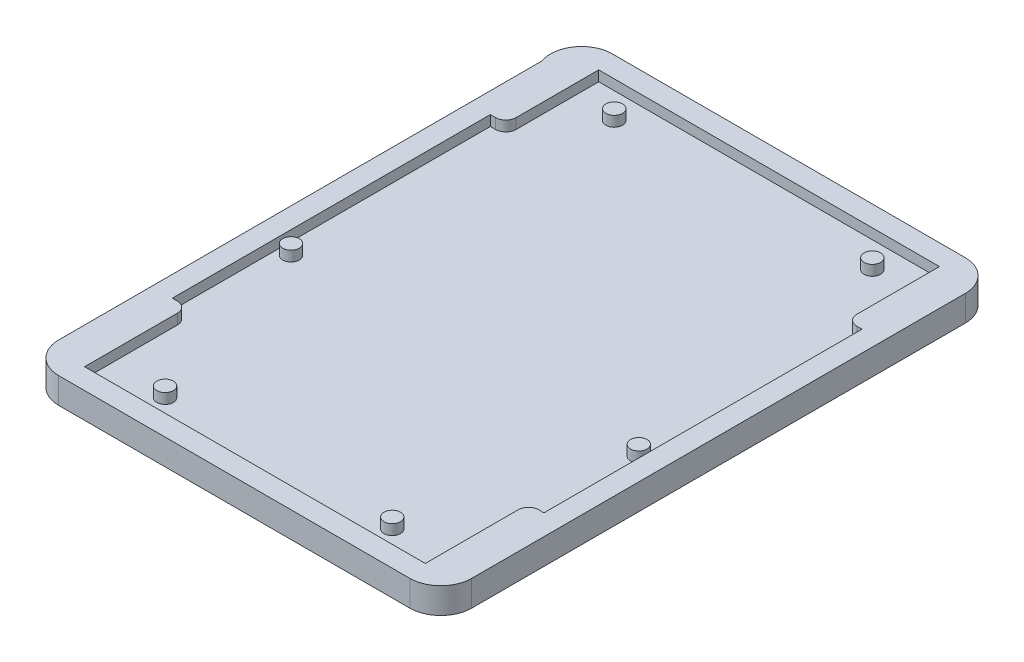
ISO-10303-21;
HEADER;
FILE_DESCRIPTION(('STEP AP214'),'2;1');
FILE_NAME('part.step','',(''),(''),'','','');
FILE_SCHEMA(('AUTOMOTIVE_DESIGN { 1 0 10303 214 1 1 1 1 }'));
ENDSEC;
DATA;
#1=APPLICATION_CONTEXT('core data for automotive mechanical design processes');
#2=APPLICATION_PROTOCOL_DEFINITION('international standard','automotive_design',2000,#1);
#3=PRODUCT_CONTEXT('',#1,'mechanical');
#4=PRODUCT('Part','Part','',(#3));
#5=PRODUCT_RELATED_PRODUCT_CATEGORY('part','',(#4));
#6=PRODUCT_DEFINITION_FORMATION('','',#4);
#7=PRODUCT_DEFINITION_CONTEXT('part definition',#1,'design');
#8=PRODUCT_DEFINITION('design','',#6,#7);
#9=PRODUCT_DEFINITION_SHAPE('','',#8);
#10=(LENGTH_UNIT() NAMED_UNIT(*) SI_UNIT(.MILLI.,.METRE.));
#11=(NAMED_UNIT(*) PLANE_ANGLE_UNIT() SI_UNIT($,.RADIAN.));
#12=(NAMED_UNIT(*) SI_UNIT($,.STERADIAN.) SOLID_ANGLE_UNIT());
#13=UNCERTAINTY_MEASURE_WITH_UNIT(LENGTH_MEASURE(1.E-05),#10,'distance_accuracy_value','');
#14=(GEOMETRIC_REPRESENTATION_CONTEXT(3) GLOBAL_UNCERTAINTY_ASSIGNED_CONTEXT((#13)) GLOBAL_UNIT_ASSIGNED_CONTEXT((#10,
#11,#12)) REPRESENTATION_CONTEXT('',''));
#15=CARTESIAN_POINT('',(0.,0.,0.));
#16=DIRECTION('',(0.,0.,1.));
#17=DIRECTION('',(1.,0.,0.));
#18=AXIS2_PLACEMENT_3D('',#15,#16,#17);
#19=CARTESIAN_POINT('',(1.65329983228431,2.,1.98997487421323));
#20=DIRECTION('',(0.,-1.,0.));
#21=DIRECTION('',(0.,0.,-1.));
#22=AXIS2_PLACEMENT_3D('',#19,#20,#21);
#23=PLANE('',#22);
#24=CARTESIAN_POINT('',(1.65329983228431,2.,1.98997487421323));
#25=DIRECTION('',(0.,-1.,0.));
#26=DIRECTION('',(0.,0.,-1.));
#27=AXIS2_PLACEMENT_3D('',#24,#25,#26);
#28=CIRCLE('',#27,5.99999999999999);
#29=CARTESIAN_POINT('',(-3.99999999999999,2.,4.00000000000002));
#30=VERTEX_POINT('',#29);
#31=CARTESIAN_POINT('',(2.,2.,-4.));
#32=VERTEX_POINT('',#31);
#33=EDGE_CURVE('E172',#30,#32,#28,.T.);
#34=ORIENTED_EDGE('',*,*,#33,.F.);
#35=DIRECTION('',(0.,0.,-1.));
#36=VECTOR('',#35,1.);
#37=CARTESIAN_POINT('',(-3.99999999999999,2.,97.6));
#38=LINE('',#37,#36);
#39=CARTESIAN_POINT('',(-3.99999999999999,2.,97.6));
#40=VERTEX_POINT('',#39);
#41=EDGE_CURVE('E141',#40,#30,#38,.T.);
#42=ORIENTED_EDGE('',*,*,#41,.F.);
#43=CARTESIAN_POINT('',(2.00000000000001,2.,97.6));
#44=DIRECTION('',(0.,-1.,0.));
#45=DIRECTION('',(0.,0.,-1.));
#46=AXIS2_PLACEMENT_3D('',#43,#44,#45);
#47=CIRCLE('',#46,6.);
#48=CARTESIAN_POINT('',(2.00000000000001,2.,103.6));
#49=VERTEX_POINT('',#48);
#50=EDGE_CURVE('E130',#49,#40,#47,.T.);
#51=ORIENTED_EDGE('',*,*,#50,.F.);
#52=DIRECTION('',(-1.,0.,0.));
#53=VECTOR('',#52,1.);
#54=CARTESIAN_POINT('',(70.,2.,103.6));
#55=LINE('',#54,#53);
#56=CARTESIAN_POINT('',(70.,2.,103.6));
#57=VERTEX_POINT('',#56);
#58=EDGE_CURVE('E142',#57,#49,#55,.T.);
#59=ORIENTED_EDGE('',*,*,#58,.F.);
#60=CARTESIAN_POINT('',(70.,2.,97.6));
#61=DIRECTION('',(0.,-1.,0.));
#62=DIRECTION('',(0.,0.,-1.));
#63=AXIS2_PLACEMENT_3D('',#60,#61,#62);
#64=CIRCLE('',#63,6.00000000000001);
#65=CARTESIAN_POINT('',(76.,2.,97.6));
#66=VERTEX_POINT('',#65);
#67=EDGE_CURVE('E146',#66,#57,#64,.T.);
#68=ORIENTED_EDGE('',*,*,#67,.F.);
#69=DIRECTION('',(0.,0.,1.));
#70=VECTOR('',#69,1.);
#71=CARTESIAN_POINT('',(76.,2.,18.));
#72=LINE('',#71,#70);
#73=CARTESIAN_POINT('',(76.,2.,2.00000000000004));
#74=VERTEX_POINT('',#73);
#75=EDGE_CURVE('E147',#74,#66,#72,.T.);
#76=ORIENTED_EDGE('',*,*,#75,.F.);
#77=CARTESIAN_POINT('',(70.,2.,2.));
#78=DIRECTION('',(0.,-1.,0.));
#79=DIRECTION('',(0.,0.,1.));
#80=AXIS2_PLACEMENT_3D('',#77,#78,#79);
#81=CIRCLE('',#80,6.);
#82=CARTESIAN_POINT('',(70.,2.,-4.));
#83=VERTEX_POINT('',#82);
#84=EDGE_CURVE('E337',#83,#74,#81,.T.);
#85=ORIENTED_EDGE('',*,*,#84,.F.);
#86=DIRECTION('',(1.,0.,0.));
#87=VECTOR('',#86,1.);
#88=CARTESIAN_POINT('',(2.,2.,-4.));
#89=LINE('',#88,#87);
#90=EDGE_CURVE('E332',#32,#83,#89,.T.);
#91=ORIENTED_EDGE('',*,*,#90,.F.);
#92=EDGE_LOOP('',(#34,#42,#51,#59,#68,#76,#85,#91));
#93=FACE_BOUND('',#92,.T.);
#94=CARTESIAN_POINT('',(1.,2.,16.));
#95=DIRECTION('',(0.,1.,0.));
#96=DIRECTION('',(0.,0.,1.));
#97=AXIS2_PLACEMENT_3D('',#94,#95,#96);
#98=CIRCLE('',#97,2.);
#99=CARTESIAN_POINT('',(3.,2.,16.));
#100=VERTEX_POINT('',#99);
#101=CARTESIAN_POINT('',(1.,2.,18.));
#102=VERTEX_POINT('',#101);
#103=EDGE_CURVE('E304',#100,#102,#98,.F.);
#104=ORIENTED_EDGE('',*,*,#103,.F.);
#105=DIRECTION('',(0.,0.,1.));
#106=VECTOR('',#105,1.);
#107=CARTESIAN_POINT('',(3.,2.,0.));
#108=LINE('',#107,#106);
#109=CARTESIAN_POINT('',(3.,2.,0.));
#110=VERTEX_POINT('',#109);
#111=EDGE_CURVE('E736',#110,#100,#108,.T.);
#112=ORIENTED_EDGE('',*,*,#111,.F.);
#113=DIRECTION('',(-1.,0.,0.));
#114=VECTOR('',#113,1.);
#115=CARTESIAN_POINT('',(0.,2.,0.));
#116=LINE('',#115,#114);
#117=CARTESIAN_POINT('',(69.,2.,0.));
#118=VERTEX_POINT('',#117);
#119=EDGE_CURVE('E265',#118,#110,#116,.T.);
#120=ORIENTED_EDGE('',*,*,#119,.F.);
#121=DIRECTION('',(0.,0.,1.));
#122=VECTOR('',#121,1.);
#123=CARTESIAN_POINT('',(69.,2.,0.));
#124=LINE('',#123,#122);
#125=CARTESIAN_POINT('',(69.,2.,16.));
#126=VERTEX_POINT('',#125);
#127=EDGE_CURVE('E810',#118,#126,#124,.T.);
#128=ORIENTED_EDGE('',*,*,#127,.T.);
#129=CARTESIAN_POINT('',(71.,2.,16.));
#130=DIRECTION('',(0.,1.,0.));
#131=DIRECTION('',(0.,0.,1.));
#132=AXIS2_PLACEMENT_3D('',#129,#130,#131);
#133=CIRCLE('',#132,2.);
#134=CARTESIAN_POINT('',(71.,2.,18.));
#135=VERTEX_POINT('',#134);
#136=EDGE_CURVE('E299',#135,#126,#133,.F.);
#137=ORIENTED_EDGE('',*,*,#136,.F.);
#138=DIRECTION('',(1.,0.,0.));
#139=VECTOR('',#138,1.);
#140=CARTESIAN_POINT('',(69.,2.,18.));
#141=LINE('',#140,#139);
#142=CARTESIAN_POINT('',(72.,2.,18.));
#143=VERTEX_POINT('',#142);
#144=EDGE_CURVE('E804',#135,#143,#141,.T.);
#145=ORIENTED_EDGE('',*,*,#144,.T.);
#146=DIRECTION('',(0.,0.,-1.));
#147=VECTOR('',#146,1.);
#148=CARTESIAN_POINT('',(72.,2.,0.));
#149=LINE('',#148,#147);
#150=CARTESIAN_POINT('',(72.,2.,79.6));
#151=VERTEX_POINT('',#150);
#152=EDGE_CURVE('E259',#151,#143,#149,.T.);
#153=ORIENTED_EDGE('',*,*,#152,.F.);
#154=DIRECTION('',(1.,0.,0.));
#155=VECTOR('',#154,1.);
#156=CARTESIAN_POINT('',(69.,2.,79.6));
#157=LINE('',#156,#155);
#158=CARTESIAN_POINT('',(71.,2.,79.6));
#159=VERTEX_POINT('',#158);
#160=EDGE_CURVE('E732',#159,#151,#157,.T.);
#161=ORIENTED_EDGE('',*,*,#160,.F.);
#162=CARTESIAN_POINT('',(71.,2.,81.6));
#163=DIRECTION('',(0.,1.,0.));
#164=DIRECTION('',(0.,0.,1.));
#165=AXIS2_PLACEMENT_3D('',#162,#163,#164);
#166=CIRCLE('',#165,2.);
#167=CARTESIAN_POINT('',(69.,2.,81.6));
#168=VERTEX_POINT('',#167);
#169=EDGE_CURVE('E330',#168,#159,#166,.F.);
#170=ORIENTED_EDGE('',*,*,#169,.F.);
#171=DIRECTION('',(0.,0.,1.));
#172=VECTOR('',#171,1.);
#173=CARTESIAN_POINT('',(69.,2.,79.6));
#174=LINE('',#173,#172);
#175=CARTESIAN_POINT('',(69.,2.,99.6));
#176=VERTEX_POINT('',#175);
#177=EDGE_CURVE('E58',#168,#176,#174,.T.);
#178=ORIENTED_EDGE('',*,*,#177,.T.);
#179=DIRECTION('',(1.,0.,0.));
#180=VECTOR('',#179,1.);
#181=CARTESIAN_POINT('',(0.,2.,99.6));
#182=LINE('',#181,#180);
#183=CARTESIAN_POINT('',(3.00000000000001,2.,99.6));
#184=VERTEX_POINT('',#183);
#185=EDGE_CURVE('E256',#184,#176,#182,.T.);
#186=ORIENTED_EDGE('',*,*,#185,.F.);
#187=DIRECTION('',(0.,0.,1.));
#188=VECTOR('',#187,1.);
#189=CARTESIAN_POINT('',(2.99999999999989,2.,0.));
#190=LINE('',#189,#188);
#191=CARTESIAN_POINT('',(3.00000000000002,2.,81.6));
#192=VERTEX_POINT('',#191);
#193=EDGE_CURVE('E739',#192,#184,#190,.T.);
#194=ORIENTED_EDGE('',*,*,#193,.F.);
#195=CARTESIAN_POINT('',(1.00000000000002,2.,81.6));
#196=DIRECTION('',(0.,1.,0.));
#197=DIRECTION('',(0.,0.,1.));
#198=AXIS2_PLACEMENT_3D('',#195,#196,#197);
#199=CIRCLE('',#198,2.);
#200=CARTESIAN_POINT('',(1.00000000000002,2.,79.6));
#201=VERTEX_POINT('',#200);
#202=EDGE_CURVE('E325',#201,#192,#199,.F.);
#203=ORIENTED_EDGE('',*,*,#202,.F.);
#204=DIRECTION('',(-1.,0.,0.));
#205=VECTOR('',#204,1.);
#206=CARTESIAN_POINT('',(0.,2.,79.6));
#207=LINE('',#206,#205);
#208=CARTESIAN_POINT('',(0.,2.,79.6));
#209=VERTEX_POINT('',#208);
#210=EDGE_CURVE('E754',#201,#209,#207,.T.);
#211=ORIENTED_EDGE('',*,*,#210,.T.);
#212=DIRECTION('',(0.,0.,1.));
#213=VECTOR('',#212,1.);
#214=CARTESIAN_POINT('',(0.,2.,0.));
#215=LINE('',#214,#213);
#216=CARTESIAN_POINT('',(0.,2.,18.));
#217=VERTEX_POINT('',#216);
#218=EDGE_CURVE('E254',#217,#209,#215,.T.);
#219=ORIENTED_EDGE('',*,*,#218,.F.);
#220=DIRECTION('',(-1.,0.,0.));
#221=VECTOR('',#220,1.);
#222=CARTESIAN_POINT('',(3.,2.,18.));
#223=LINE('',#222,#221);
#224=EDGE_CURVE('E748',#102,#217,#223,.T.);
#225=ORIENTED_EDGE('',*,*,#224,.F.);
#226=EDGE_LOOP('',(#104,#112,#120,#128,#137,#145,#153,#161,#170,#178,#186,#194,#203,#211,#219,#225));
#227=FACE_BOUND('',#226,.T.);
#228=ADVANCED_FACE('F43',(#93,#227),#23,.F.);
#229=CARTESIAN_POINT('',(1.65329983228431,2.,1.98997487421323));
#230=DIRECTION('',(0.,-1.,0.));
#231=DIRECTION('',(0.,0.,-1.));
#232=AXIS2_PLACEMENT_3D('',#229,#230,#231);
#233=CYLINDRICAL_SURFACE('',#232,5.99999999999999);
#234=CARTESIAN_POINT('',(1.65329983228431,-3.,1.98997487421323));
#235=DIRECTION('',(0.,-1.,0.));
#236=DIRECTION('',(0.,0.,-1.));
#237=AXIS2_PLACEMENT_3D('',#234,#235,#236);
#238=CIRCLE('',#237,5.99999999999999);
#239=CARTESIAN_POINT('',(-3.99999999999999,-3.,4.00000000000002));
#240=VERTEX_POINT('',#239);
#241=CARTESIAN_POINT('',(2.,-3.,-4.));
#242=VERTEX_POINT('',#241);
#243=EDGE_CURVE('E155',#240,#242,#238,.T.);
#244=ORIENTED_EDGE('',*,*,#243,.F.);
#245=DIRECTION('',(0.,-1.,0.));
#246=VECTOR('',#245,1.);
#247=CARTESIAN_POINT('',(-3.99999999999999,2.,4.00000000000002));
#248=LINE('',#247,#246);
#249=EDGE_CURVE('E11',#30,#240,#248,.T.);
#250=ORIENTED_EDGE('',*,*,#249,.F.);
#251=ORIENTED_EDGE('',*,*,#33,.T.);
#252=DIRECTION('',(0.,-1.,0.));
#253=VECTOR('',#252,1.);
#254=CARTESIAN_POINT('',(2.,2.,-4.));
#255=LINE('',#254,#253);
#256=EDGE_CURVE('E50',#32,#242,#255,.T.);
#257=ORIENTED_EDGE('',*,*,#256,.T.);
#258=EDGE_LOOP('',(#244,#250,#251,#257));
#259=FACE_BOUND('',#258,.T.);
#260=ADVANCED_FACE('F44',(#259),#233,.T.);
#261=CARTESIAN_POINT('',(-3.99999999999999,2.,97.6));
#262=DIRECTION('',(-1.,0.,0.));
#263=DIRECTION('',(0.,0.,1.));
#264=AXIS2_PLACEMENT_3D('',#261,#262,#263);
#265=PLANE('',#264);
#266=DIRECTION('',(0.,0.,-1.));
#267=VECTOR('',#266,1.);
#268=CARTESIAN_POINT('',(-3.99999999999999,-3.,97.6));
#269=LINE('',#268,#267);
#270=CARTESIAN_POINT('',(-3.99999999999999,-3.,97.6));
#271=VERTEX_POINT('',#270);
#272=EDGE_CURVE('E175',#271,#240,#269,.T.);
#273=ORIENTED_EDGE('',*,*,#272,.F.);
#274=DIRECTION('',(0.,-1.,0.));
#275=VECTOR('',#274,1.);
#276=CARTESIAN_POINT('',(-3.99999999999999,2.,97.6));
#277=LINE('',#276,#275);
#278=EDGE_CURVE('E55',#40,#271,#277,.T.);
#279=ORIENTED_EDGE('',*,*,#278,.F.);
#280=ORIENTED_EDGE('',*,*,#41,.T.);
#281=ORIENTED_EDGE('',*,*,#249,.T.);
#282=EDGE_LOOP('',(#273,#279,#280,#281));
#283=FACE_BOUND('',#282,.T.);
#284=ADVANCED_FACE('F190',(#283),#265,.T.);
#285=CARTESIAN_POINT('',(2.00000000000001,2.,97.6));
#286=DIRECTION('',(0.,-1.,0.));
#287=DIRECTION('',(0.,0.,-1.));
#288=AXIS2_PLACEMENT_3D('',#285,#286,#287);
#289=CYLINDRICAL_SURFACE('',#288,6.);
#290=CARTESIAN_POINT('',(2.00000000000001,-3.,97.6));
#291=DIRECTION('',(0.,-1.,0.));
#292=DIRECTION('',(0.,0.,-1.));
#293=AXIS2_PLACEMENT_3D('',#290,#291,#292);
#294=CIRCLE('',#293,6.);
#295=CARTESIAN_POINT('',(2.00000000000001,-3.,103.6));
#296=VERTEX_POINT('',#295);
#297=EDGE_CURVE('E129',#296,#271,#294,.T.);
#298=ORIENTED_EDGE('',*,*,#297,.F.);
#299=DIRECTION('',(0.,-1.,0.));
#300=VECTOR('',#299,1.);
#301=CARTESIAN_POINT('',(2.00000000000001,2.,103.6));
#302=LINE('',#301,#300);
#303=EDGE_CURVE('E121',#49,#296,#302,.T.);
#304=ORIENTED_EDGE('',*,*,#303,.F.);
#305=ORIENTED_EDGE('',*,*,#50,.T.);
#306=ORIENTED_EDGE('',*,*,#278,.T.);
#307=EDGE_LOOP('',(#298,#304,#305,#306));
#308=FACE_BOUND('',#307,.T.);
#309=ADVANCED_FACE('F126',(#308),#289,.T.);
#310=CARTESIAN_POINT('',(70.,2.,103.6));
#311=DIRECTION('',(0.,0.,1.));
#312=DIRECTION('',(1.,0.,0.));
#313=AXIS2_PLACEMENT_3D('',#310,#311,#312);
#314=PLANE('',#313);
#315=DIRECTION('',(-1.,0.,0.));
#316=VECTOR('',#315,1.);
#317=CARTESIAN_POINT('',(70.,-3.,103.6));
#318=LINE('',#317,#316);
#319=CARTESIAN_POINT('',(70.,-3.,103.6));
#320=VERTEX_POINT('',#319);
#321=EDGE_CURVE('E169',#320,#296,#318,.T.);
#322=ORIENTED_EDGE('',*,*,#321,.F.);
#323=DIRECTION('',(0.,-1.,0.));
#324=VECTOR('',#323,1.);
#325=CARTESIAN_POINT('',(70.,2.,103.6));
#326=LINE('',#325,#324);
#327=EDGE_CURVE('E133',#57,#320,#326,.T.);
#328=ORIENTED_EDGE('',*,*,#327,.F.);
#329=ORIENTED_EDGE('',*,*,#58,.T.);
#330=ORIENTED_EDGE('',*,*,#303,.T.);
#331=EDGE_LOOP('',(#322,#328,#329,#330));
#332=FACE_BOUND('',#331,.T.);
#333=ADVANCED_FACE('F143',(#332),#314,.T.);
#334=CARTESIAN_POINT('',(70.,2.,97.6));
#335=DIRECTION('',(0.,-1.,0.));
#336=DIRECTION('',(0.,0.,-1.));
#337=AXIS2_PLACEMENT_3D('',#334,#335,#336);
#338=CYLINDRICAL_SURFACE('',#337,6.00000000000001);
#339=CARTESIAN_POINT('',(70.,-3.,97.6));
#340=DIRECTION('',(0.,-1.,0.));
#341=DIRECTION('',(0.,0.,-1.));
#342=AXIS2_PLACEMENT_3D('',#339,#340,#341);
#343=CIRCLE('',#342,6.00000000000001);
#344=CARTESIAN_POINT('',(76.,-3.,97.6));
#345=VERTEX_POINT('',#344);
#346=EDGE_CURVE('E168',#345,#320,#343,.T.);
#347=ORIENTED_EDGE('',*,*,#346,.F.);
#348=DIRECTION('',(0.,-1.,0.));
#349=VECTOR('',#348,1.);
#350=CARTESIAN_POINT('',(76.,2.,97.6));
#351=LINE('',#350,#349);
#352=EDGE_CURVE('E178',#66,#345,#351,.T.);
#353=ORIENTED_EDGE('',*,*,#352,.F.);
#354=ORIENTED_EDGE('',*,*,#67,.T.);
#355=ORIENTED_EDGE('',*,*,#327,.T.);
#356=EDGE_LOOP('',(#347,#353,#354,#355));
#357=FACE_BOUND('',#356,.T.);
#358=ADVANCED_FACE('F344',(#357),#338,.T.);
#359=CARTESIAN_POINT('',(76.,2.,18.));
#360=DIRECTION('',(1.,0.,0.));
#361=DIRECTION('',(0.,0.,-1.));
#362=AXIS2_PLACEMENT_3D('',#359,#360,#361);
#363=PLANE('',#362);
#364=DIRECTION('',(0.,0.,1.));
#365=VECTOR('',#364,1.);
#366=CARTESIAN_POINT('',(76.,-3.,18.));
#367=LINE('',#366,#365);
#368=CARTESIAN_POINT('',(76.,-3.,2.00000000000004));
#369=VERTEX_POINT('',#368);
#370=EDGE_CURVE('E161',#369,#345,#367,.T.);
#371=ORIENTED_EDGE('',*,*,#370,.F.);
#372=DIRECTION('',(0.,-1.,0.));
#373=VECTOR('',#372,1.);
#374=CARTESIAN_POINT('',(76.,2.,2.00000000000004));
#375=LINE('',#374,#373);
#376=EDGE_CURVE('E179',#74,#369,#375,.T.);
#377=ORIENTED_EDGE('',*,*,#376,.F.);
#378=ORIENTED_EDGE('',*,*,#75,.T.);
#379=ORIENTED_EDGE('',*,*,#352,.T.);
#380=EDGE_LOOP('',(#371,#377,#378,#379));
#381=FACE_BOUND('',#380,.T.);
#382=ADVANCED_FACE('F341',(#381),#363,.T.);
#383=CARTESIAN_POINT('',(70.,2.,2.));
#384=DIRECTION('',(0.,-1.,0.));
#385=DIRECTION('',(0.,0.,-1.));
#386=AXIS2_PLACEMENT_3D('',#383,#384,#385);
#387=CYLINDRICAL_SURFACE('',#386,6.);
#388=CARTESIAN_POINT('',(70.,-3.,2.));
#389=DIRECTION('',(0.,-1.,0.));
#390=DIRECTION('',(0.,0.,1.));
#391=AXIS2_PLACEMENT_3D('',#388,#389,#390);
#392=CIRCLE('',#391,6.);
#393=CARTESIAN_POINT('',(70.,-3.,-4.));
#394=VERTEX_POINT('',#393);
#395=EDGE_CURVE('E157',#394,#369,#392,.T.);
#396=ORIENTED_EDGE('',*,*,#395,.F.);
#397=DIRECTION('',(0.,-1.,0.));
#398=VECTOR('',#397,1.);
#399=CARTESIAN_POINT('',(70.,2.,-4.));
#400=LINE('',#399,#398);
#401=EDGE_CURVE('E185',#83,#394,#400,.T.);
#402=ORIENTED_EDGE('',*,*,#401,.F.);
#403=ORIENTED_EDGE('',*,*,#84,.T.);
#404=ORIENTED_EDGE('',*,*,#376,.T.);
#405=EDGE_LOOP('',(#396,#402,#403,#404));
#406=FACE_BOUND('',#405,.T.);
#407=ADVANCED_FACE('F349',(#406),#387,.T.);
#408=CARTESIAN_POINT('',(2.,2.,-4.));
#409=DIRECTION('',(0.,0.,-1.));
#410=DIRECTION('',(-1.,0.,0.));
#411=AXIS2_PLACEMENT_3D('',#408,#409,#410);
#412=PLANE('',#411);
#413=DIRECTION('',(1.,0.,0.));
#414=VECTOR('',#413,1.);
#415=CARTESIAN_POINT('',(2.,-3.,-4.));
#416=LINE('',#415,#414);
#417=EDGE_CURVE('E158',#242,#394,#416,.T.);
#418=ORIENTED_EDGE('',*,*,#417,.F.);
#419=ORIENTED_EDGE('',*,*,#256,.F.);
#420=ORIENTED_EDGE('',*,*,#90,.T.);
#421=ORIENTED_EDGE('',*,*,#401,.T.);
#422=EDGE_LOOP('',(#418,#419,#420,#421));
#423=FACE_BOUND('',#422,.T.);
#424=ADVANCED_FACE('F183',(#423),#412,.T.);
#425=CARTESIAN_POINT('',(1.65329983228431,-3.,1.98997487421323));
#426=DIRECTION('',(0.,-1.,0.));
#427=DIRECTION('',(0.,0.,-1.));
#428=AXIS2_PLACEMENT_3D('',#425,#426,#427);
#429=PLANE('',#428);
#430=ORIENTED_EDGE('',*,*,#243,.T.);
#431=ORIENTED_EDGE('',*,*,#417,.T.);
#432=ORIENTED_EDGE('',*,*,#395,.T.);
#433=ORIENTED_EDGE('',*,*,#370,.T.);
#434=ORIENTED_EDGE('',*,*,#346,.T.);
#435=ORIENTED_EDGE('',*,*,#321,.T.);
#436=ORIENTED_EDGE('',*,*,#297,.T.);
#437=ORIENTED_EDGE('',*,*,#272,.T.);
#438=EDGE_LOOP('',(#430,#431,#432,#433,#434,#435,#436,#437));
#439=FACE_BOUND('',#438,.T.);
#440=ADVANCED_FACE('F187',(#439),#429,.T.);
#441=CARTESIAN_POINT('',(0.,0.,0.));
#442=DIRECTION('',(0.,1.,0.));
#443=DIRECTION('',(0.,0.,1.));
#444=AXIS2_PLACEMENT_3D('',#441,#442,#443);
#445=PLANE('',#444);
#446=CARTESIAN_POINT('',(11.,0.,5.));
#447=DIRECTION('',(0.,1.,0.));
#448=DIRECTION('',(0.,0.,1.));
#449=AXIS2_PLACEMENT_3D('',#446,#447,#448);
#450=CIRCLE('',#449,1.6);
#451=CARTESIAN_POINT('',(11.,0.,6.60000000000001));
#452=VERTEX_POINT('',#451);
#453=EDGE_CURVE('E242',#452,#452,#450,.T.);
#454=ORIENTED_EDGE('',*,*,#453,.F.);
#455=EDGE_LOOP('',(#454));
#456=FACE_BOUND('',#455,.T.);
#457=CARTESIAN_POINT('',(14.,0.,95.));
#458=DIRECTION('',(0.,1.,0.));
#459=DIRECTION('',(0.,0.,1.));
#460=AXIS2_PLACEMENT_3D('',#457,#458,#459);
#461=CIRCLE('',#460,1.60000000000001);
#462=CARTESIAN_POINT('',(14.,0.,96.6));
#463=VERTEX_POINT('',#462);
#464=EDGE_CURVE('E238',#463,#463,#461,.T.);
#465=ORIENTED_EDGE('',*,*,#464,.F.);
#466=EDGE_LOOP('',(#465));
#467=FACE_BOUND('',#466,.T.);
#468=CARTESIAN_POINT('',(58.,0.,95.));
#469=DIRECTION('',(0.,1.,0.));
#470=DIRECTION('',(0.,0.,-1.));
#471=AXIS2_PLACEMENT_3D('',#468,#469,#470);
#472=CIRCLE('',#471,1.60000000000001);
#473=CARTESIAN_POINT('',(58.,0.,93.4));
#474=VERTEX_POINT('',#473);
#475=EDGE_CURVE('E231',#474,#474,#472,.T.);
#476=ORIENTED_EDGE('',*,*,#475,.F.);
#477=EDGE_LOOP('',(#476));
#478=FACE_BOUND('',#477,.T.);
#479=CARTESIAN_POINT('',(61.,0.,5.));
#480=DIRECTION('',(0.,1.,0.));
#481=DIRECTION('',(0.,0.,-1.));
#482=AXIS2_PLACEMENT_3D('',#479,#480,#481);
#483=CIRCLE('',#482,1.60000000000001);
#484=CARTESIAN_POINT('',(61.,0.,3.4));
#485=VERTEX_POINT('',#484);
#486=EDGE_CURVE('E216',#485,#485,#483,.T.);
#487=ORIENTED_EDGE('',*,*,#486,.F.);
#488=EDGE_LOOP('',(#487));
#489=FACE_BOUND('',#488,.T.);
#490=CARTESIAN_POINT('',(2.31,0.,58.92));
#491=DIRECTION('',(0.,1.,0.));
#492=DIRECTION('',(0.,0.,1.));
#493=AXIS2_PLACEMENT_3D('',#490,#491,#492);
#494=CIRCLE('',#493,1.6);
#495=CARTESIAN_POINT('',(2.31,0.,60.52));
#496=VERTEX_POINT('',#495);
#497=EDGE_CURVE('E218',#496,#496,#494,.T.);
#498=ORIENTED_EDGE('',*,*,#497,.F.);
#499=EDGE_LOOP('',(#498));
#500=FACE_BOUND('',#499,.T.);
#501=CARTESIAN_POINT('',(69.69,0.,58.92));
#502=DIRECTION('',(0.,1.,0.));
#503=DIRECTION('',(0.,0.,-1.));
#504=AXIS2_PLACEMENT_3D('',#501,#502,#503);
#505=CIRCLE('',#504,1.60000000000001);
#506=CARTESIAN_POINT('',(69.69,0.,57.32));
#507=VERTEX_POINT('',#506);
#508=EDGE_CURVE('E230',#507,#507,#505,.T.);
#509=ORIENTED_EDGE('',*,*,#508,.F.);
#510=EDGE_LOOP('',(#509));
#511=FACE_BOUND('',#510,.T.);
#512=DIRECTION('',(-1.,0.,0.));
#513=VECTOR('',#512,1.);
#514=CARTESIAN_POINT('',(0.,0.,0.));
#515=LINE('',#514,#513);
#516=CARTESIAN_POINT('',(69.,0.,0.));
#517=VERTEX_POINT('',#516);
#518=CARTESIAN_POINT('',(3.,0.,0.));
#519=VERTEX_POINT('',#518);
#520=EDGE_CURVE('E260',#517,#519,#515,.T.);
#521=ORIENTED_EDGE('',*,*,#520,.T.);
#522=DIRECTION('',(0.,0.,1.));
#523=VECTOR('',#522,1.);
#524=CARTESIAN_POINT('',(3.,0.,0.));
#525=LINE('',#524,#523);
#526=CARTESIAN_POINT('',(3.,0.,16.));
#527=VERTEX_POINT('',#526);
#528=EDGE_CURVE('E659',#519,#527,#525,.T.);
#529=ORIENTED_EDGE('',*,*,#528,.T.);
#530=CARTESIAN_POINT('',(1.,0.,16.));
#531=DIRECTION('',(0.,1.,0.));
#532=DIRECTION('',(0.,0.,1.));
#533=AXIS2_PLACEMENT_3D('',#530,#531,#532);
#534=CIRCLE('',#533,2.);
#535=CARTESIAN_POINT('',(1.,0.,18.));
#536=VERTEX_POINT('',#535);
#537=EDGE_CURVE('E308',#536,#527,#534,.T.);
#538=ORIENTED_EDGE('',*,*,#537,.F.);
#539=DIRECTION('',(-1.,0.,0.));
#540=VECTOR('',#539,1.);
#541=CARTESIAN_POINT('',(0.,0.,18.));
#542=LINE('',#541,#540);
#543=CARTESIAN_POINT('',(0.,0.,18.));
#544=VERTEX_POINT('',#543);
#545=EDGE_CURVE('E762',#536,#544,#542,.T.);
#546=ORIENTED_EDGE('',*,*,#545,.T.);
#547=DIRECTION('',(0.,0.,1.));
#548=VECTOR('',#547,1.);
#549=CARTESIAN_POINT('',(0.,0.,0.));
#550=LINE('',#549,#548);
#551=CARTESIAN_POINT('',(0.,0.,79.6));
#552=VERTEX_POINT('',#551);
#553=EDGE_CURVE('E249',#544,#552,#550,.T.);
#554=ORIENTED_EDGE('',*,*,#553,.T.);
#555=DIRECTION('',(-1.,0.,0.));
#556=VECTOR('',#555,1.);
#557=CARTESIAN_POINT('',(0.,0.,79.6));
#558=LINE('',#557,#556);
#559=CARTESIAN_POINT('',(1.00000000000002,0.,79.6));
#560=VERTEX_POINT('',#559);
#561=EDGE_CURVE('E723',#560,#552,#558,.T.);
#562=ORIENTED_EDGE('',*,*,#561,.F.);
#563=CARTESIAN_POINT('',(1.00000000000002,0.,81.6));
#564=DIRECTION('',(0.,1.,0.));
#565=DIRECTION('',(0.,0.,1.));
#566=AXIS2_PLACEMENT_3D('',#563,#564,#565);
#567=CIRCLE('',#566,2.);
#568=CARTESIAN_POINT('',(3.00000000000002,0.,81.6));
#569=VERTEX_POINT('',#568);
#570=EDGE_CURVE('E324',#569,#560,#567,.T.);
#571=ORIENTED_EDGE('',*,*,#570,.F.);
#572=DIRECTION('',(0.,0.,1.));
#573=VECTOR('',#572,1.);
#574=CARTESIAN_POINT('',(2.99999999999989,0.,0.));
#575=LINE('',#574,#573);
#576=CARTESIAN_POINT('',(3.00000000000001,0.,99.6));
#577=VERTEX_POINT('',#576);
#578=EDGE_CURVE('E726',#569,#577,#575,.T.);
#579=ORIENTED_EDGE('',*,*,#578,.T.);
#580=DIRECTION('',(1.,0.,0.));
#581=VECTOR('',#580,1.);
#582=CARTESIAN_POINT('',(0.,0.,99.6));
#583=LINE('',#582,#581);
#584=CARTESIAN_POINT('',(69.,0.,99.6));
#585=VERTEX_POINT('',#584);
#586=EDGE_CURVE('E267',#577,#585,#583,.T.);
#587=ORIENTED_EDGE('',*,*,#586,.T.);
#588=DIRECTION('',(0.,0.,1.));
#589=VECTOR('',#588,1.);
#590=CARTESIAN_POINT('',(69.,0.,0.));
#591=LINE('',#590,#589);
#592=CARTESIAN_POINT('',(69.,0.,81.6));
#593=VERTEX_POINT('',#592);
#594=EDGE_CURVE('E722',#593,#585,#591,.T.);
#595=ORIENTED_EDGE('',*,*,#594,.F.);
#596=CARTESIAN_POINT('',(71.,0.,81.6));
#597=DIRECTION('',(0.,1.,0.));
#598=DIRECTION('',(0.,0.,1.));
#599=AXIS2_PLACEMENT_3D('',#596,#597,#598);
#600=CIRCLE('',#599,2.);
#601=CARTESIAN_POINT('',(71.,0.,79.6));
#602=VERTEX_POINT('',#601);
#603=EDGE_CURVE('E160',#602,#593,#600,.T.);
#604=ORIENTED_EDGE('',*,*,#603,.F.);
#605=DIRECTION('',(1.,0.,0.));
#606=VECTOR('',#605,1.);
#607=CARTESIAN_POINT('',(0.,0.,79.6));
#608=LINE('',#607,#606);
#609=CARTESIAN_POINT('',(72.,0.,79.6));
#610=VERTEX_POINT('',#609);
#611=EDGE_CURVE('E717',#602,#610,#608,.T.);
#612=ORIENTED_EDGE('',*,*,#611,.T.);
#613=DIRECTION('',(0.,0.,-1.));
#614=VECTOR('',#613,1.);
#615=CARTESIAN_POINT('',(72.,0.,0.));
#616=LINE('',#615,#614);
#617=CARTESIAN_POINT('',(72.,0.,18.));
#618=VERTEX_POINT('',#617);
#619=EDGE_CURVE('E275',#610,#618,#616,.T.);
#620=ORIENTED_EDGE('',*,*,#619,.T.);
#621=DIRECTION('',(1.,0.,0.));
#622=VECTOR('',#621,1.);
#623=CARTESIAN_POINT('',(0.,0.,18.));
#624=LINE('',#623,#622);
#625=CARTESIAN_POINT('',(71.,0.,18.));
#626=VERTEX_POINT('',#625);
#627=EDGE_CURVE('E747',#626,#618,#624,.T.);
#628=ORIENTED_EDGE('',*,*,#627,.F.);
#629=CARTESIAN_POINT('',(71.,0.,16.));
#630=DIRECTION('',(0.,1.,0.));
#631=DIRECTION('',(0.,0.,1.));
#632=AXIS2_PLACEMENT_3D('',#629,#630,#631);
#633=CIRCLE('',#632,2.);
#634=CARTESIAN_POINT('',(69.,0.,16.));
#635=VERTEX_POINT('',#634);
#636=EDGE_CURVE('E305',#635,#626,#633,.T.);
#637=ORIENTED_EDGE('',*,*,#636,.F.);
#638=DIRECTION('',(0.,0.,1.));
#639=VECTOR('',#638,1.);
#640=CARTESIAN_POINT('',(69.,0.,0.));
#641=LINE('',#640,#639);
#642=EDGE_CURVE('E663',#517,#635,#641,.T.);
#643=ORIENTED_EDGE('',*,*,#642,.F.);
#644=EDGE_LOOP('',(#521,#529,#538,#546,#554,#562,#571,#579,#587,#595,#604,#612,#620,#628,#637,#643));
#645=FACE_BOUND('',#644,.T.);
#646=ADVANCED_FACE('F390',(#456,#467,#478,#489,#500,#511,#645),#445,.T.);
#647=CARTESIAN_POINT('',(0.,2.,0.));
#648=DIRECTION('',(1.,0.,0.));
#649=DIRECTION('',(0.,0.,-1.));
#650=AXIS2_PLACEMENT_3D('',#647,#648,#649);
#651=PLANE('',#650);
#652=DIRECTION('',(0.,1.,0.));
#653=VECTOR('',#652,1.);
#654=CARTESIAN_POINT('',(0.,-8.,18.));
#655=LINE('',#654,#653);
#656=EDGE_CURVE('E741',#544,#217,#655,.T.);
#657=ORIENTED_EDGE('',*,*,#656,.T.);
#658=ORIENTED_EDGE('',*,*,#218,.T.);
#659=DIRECTION('',(0.,1.,0.));
#660=VECTOR('',#659,1.);
#661=CARTESIAN_POINT('',(0.,-8.,79.6));
#662=LINE('',#661,#660);
#663=EDGE_CURVE('E760',#552,#209,#662,.T.);
#664=ORIENTED_EDGE('',*,*,#663,.F.);
#665=ORIENTED_EDGE('',*,*,#553,.F.);
#666=EDGE_LOOP('',(#657,#658,#664,#665));
#667=FACE_BOUND('',#666,.T.);
#668=ADVANCED_FACE('F397',(#667),#651,.T.);
#669=CARTESIAN_POINT('',(72.,2.,0.));
#670=DIRECTION('',(-1.,0.,0.));
#671=DIRECTION('',(0.,0.,1.));
#672=AXIS2_PLACEMENT_3D('',#669,#670,#671);
#673=PLANE('',#672);
#674=ORIENTED_EDGE('',*,*,#619,.F.);
#675=DIRECTION('',(0.,1.,0.));
#676=VECTOR('',#675,1.);
#677=CARTESIAN_POINT('',(72.,-8.,79.6));
#678=LINE('',#677,#676);
#679=EDGE_CURVE('E716',#610,#151,#678,.T.);
#680=ORIENTED_EDGE('',*,*,#679,.T.);
#681=ORIENTED_EDGE('',*,*,#152,.T.);
#682=DIRECTION('',(0.,1.,0.));
#683=VECTOR('',#682,1.);
#684=CARTESIAN_POINT('',(72.,-8.,18.));
#685=LINE('',#684,#683);
#686=EDGE_CURVE('E799',#618,#143,#685,.T.);
#687=ORIENTED_EDGE('',*,*,#686,.F.);
#688=EDGE_LOOP('',(#674,#680,#681,#687));
#689=FACE_BOUND('',#688,.T.);
#690=ADVANCED_FACE('F408',(#689),#673,.T.);
#691=CARTESIAN_POINT('',(0.,2.,99.6));
#692=DIRECTION('',(0.,0.,-1.));
#693=DIRECTION('',(-1.,0.,0.));
#694=AXIS2_PLACEMENT_3D('',#691,#692,#693);
#695=PLANE('',#694);
#696=ORIENTED_EDGE('',*,*,#586,.F.);
#697=DIRECTION('',(0.,-1.,0.));
#698=VECTOR('',#697,1.);
#699=CARTESIAN_POINT('',(3.00000000000001,2.,99.6));
#700=LINE('',#699,#698);
#701=EDGE_CURVE('E284',#184,#577,#700,.T.);
#702=ORIENTED_EDGE('',*,*,#701,.F.);
#703=ORIENTED_EDGE('',*,*,#185,.T.);
#704=DIRECTION('',(0.,-1.,0.));
#705=VECTOR('',#704,1.);
#706=CARTESIAN_POINT('',(69.,2.,99.6));
#707=LINE('',#706,#705);
#708=EDGE_CURVE('E283',#585,#176,#707,.F.);
#709=ORIENTED_EDGE('',*,*,#708,.F.);
#710=EDGE_LOOP('',(#696,#702,#703,#709));
#711=FACE_BOUND('',#710,.T.);
#712=ADVANCED_FACE('F416',(#711),#695,.T.);
#713=CARTESIAN_POINT('',(0.,2.,0.));
#714=DIRECTION('',(0.,0.,1.));
#715=DIRECTION('',(1.,0.,0.));
#716=AXIS2_PLACEMENT_3D('',#713,#714,#715);
#717=PLANE('',#716);
#718=ORIENTED_EDGE('',*,*,#520,.F.);
#719=DIRECTION('',(0.,-1.,0.));
#720=VECTOR('',#719,1.);
#721=CARTESIAN_POINT('',(69.,2.,0.));
#722=LINE('',#721,#720);
#723=EDGE_CURVE('E268',#118,#517,#722,.T.);
#724=ORIENTED_EDGE('',*,*,#723,.F.);
#725=ORIENTED_EDGE('',*,*,#119,.T.);
#726=DIRECTION('',(0.,-1.,0.));
#727=VECTOR('',#726,1.);
#728=CARTESIAN_POINT('',(3.,2.,0.));
#729=LINE('',#728,#727);
#730=EDGE_CURVE('E278',#519,#110,#729,.F.);
#731=ORIENTED_EDGE('',*,*,#730,.F.);
#732=EDGE_LOOP('',(#718,#724,#725,#731));
#733=FACE_BOUND('',#732,.T.);
#734=ADVANCED_FACE('F426',(#733),#717,.T.);
#735=CARTESIAN_POINT('',(11.,2.,5.));
#736=DIRECTION('',(0.,-1.,0.));
#737=DIRECTION('',(0.,0.,-1.));
#738=AXIS2_PLACEMENT_3D('',#735,#736,#737);
#739=CYLINDRICAL_SURFACE('',#738,1.6);
#740=CARTESIAN_POINT('',(11.,2.,5.));
#741=DIRECTION('',(0.,1.,0.));
#742=DIRECTION('',(0.,0.,1.));
#743=AXIS2_PLACEMENT_3D('',#740,#741,#742);
#744=CIRCLE('',#743,1.6);
#745=CARTESIAN_POINT('',(11.,2.,6.60000000000001));
#746=VERTEX_POINT('',#745);
#747=EDGE_CURVE('E250',#746,#746,#744,.T.);
#748=ORIENTED_EDGE('',*,*,#747,.F.);
#749=EDGE_LOOP('',(#748));
#750=FACE_BOUND('',#749,.T.);
#751=ORIENTED_EDGE('',*,*,#453,.T.);
#752=EDGE_LOOP('',(#751));
#753=FACE_BOUND('',#752,.T.);
#754=ADVANCED_FACE('F440',(#750,#753),#739,.T.);
#755=CARTESIAN_POINT('',(14.,2.,95.));
#756=DIRECTION('',(0.,-1.,0.));
#757=DIRECTION('',(0.,0.,-1.));
#758=AXIS2_PLACEMENT_3D('',#755,#756,#757);
#759=CYLINDRICAL_SURFACE('',#758,1.60000000000001);
#760=CARTESIAN_POINT('',(14.,2.,95.));
#761=DIRECTION('',(0.,1.,0.));
#762=DIRECTION('',(0.,0.,1.));
#763=AXIS2_PLACEMENT_3D('',#760,#761,#762);
#764=CIRCLE('',#763,1.60000000000001);
#765=CARTESIAN_POINT('',(14.,2.,96.6));
#766=VERTEX_POINT('',#765);
#767=EDGE_CURVE('E241',#766,#766,#764,.T.);
#768=ORIENTED_EDGE('',*,*,#767,.F.);
#769=EDGE_LOOP('',(#768));
#770=FACE_BOUND('',#769,.T.);
#771=ORIENTED_EDGE('',*,*,#464,.T.);
#772=EDGE_LOOP('',(#771));
#773=FACE_BOUND('',#772,.T.);
#774=ADVANCED_FACE('F447',(#770,#773),#759,.T.);
#775=CARTESIAN_POINT('',(58.,2.,95.));
#776=DIRECTION('',(0.,-1.,0.));
#777=DIRECTION('',(0.,0.,-1.));
#778=AXIS2_PLACEMENT_3D('',#775,#776,#777);
#779=CYLINDRICAL_SURFACE('',#778,1.60000000000001);
#780=CARTESIAN_POINT('',(58.,2.,95.));
#781=DIRECTION('',(0.,1.,0.));
#782=DIRECTION('',(0.,0.,-1.));
#783=AXIS2_PLACEMENT_3D('',#780,#781,#782);
#784=CIRCLE('',#783,1.60000000000001);
#785=CARTESIAN_POINT('',(58.,2.,93.4));
#786=VERTEX_POINT('',#785);
#787=EDGE_CURVE('E232',#786,#786,#784,.T.);
#788=ORIENTED_EDGE('',*,*,#787,.F.);
#789=EDGE_LOOP('',(#788));
#790=FACE_BOUND('',#789,.T.);
#791=ORIENTED_EDGE('',*,*,#475,.T.);
#792=EDGE_LOOP('',(#791));
#793=FACE_BOUND('',#792,.T.);
#794=ADVANCED_FACE('F454',(#790,#793),#779,.T.);
#795=CARTESIAN_POINT('',(61.,2.,5.));
#796=DIRECTION('',(0.,-1.,0.));
#797=DIRECTION('',(0.,0.,-1.));
#798=AXIS2_PLACEMENT_3D('',#795,#796,#797);
#799=CYLINDRICAL_SURFACE('',#798,1.60000000000001);
#800=CARTESIAN_POINT('',(61.,2.,5.));
#801=DIRECTION('',(0.,1.,0.));
#802=DIRECTION('',(0.,0.,-1.));
#803=AXIS2_PLACEMENT_3D('',#800,#801,#802);
#804=CIRCLE('',#803,1.60000000000001);
#805=CARTESIAN_POINT('',(61.,2.,3.4));
#806=VERTEX_POINT('',#805);
#807=EDGE_CURVE('E221',#806,#806,#804,.T.);
#808=ORIENTED_EDGE('',*,*,#807,.F.);
#809=EDGE_LOOP('',(#808));
#810=FACE_BOUND('',#809,.T.);
#811=ORIENTED_EDGE('',*,*,#486,.T.);
#812=EDGE_LOOP('',(#811));
#813=FACE_BOUND('',#812,.T.);
#814=ADVANCED_FACE('F462',(#810,#813),#799,.T.);
#815=CARTESIAN_POINT('',(2.31,2.,58.92));
#816=DIRECTION('',(0.,-1.,0.));
#817=DIRECTION('',(0.,0.,-1.));
#818=AXIS2_PLACEMENT_3D('',#815,#816,#817);
#819=CYLINDRICAL_SURFACE('',#818,1.6);
#820=CARTESIAN_POINT('',(2.31,2.,58.92));
#821=DIRECTION('',(0.,1.,0.));
#822=DIRECTION('',(0.,0.,1.));
#823=AXIS2_PLACEMENT_3D('',#820,#821,#822);
#824=CIRCLE('',#823,1.6);
#825=CARTESIAN_POINT('',(2.31,2.,60.52));
#826=VERTEX_POINT('',#825);
#827=EDGE_CURVE('E219',#826,#826,#824,.T.);
#828=ORIENTED_EDGE('',*,*,#827,.F.);
#829=EDGE_LOOP('',(#828));
#830=FACE_BOUND('',#829,.T.);
#831=ORIENTED_EDGE('',*,*,#497,.T.);
#832=EDGE_LOOP('',(#831));
#833=FACE_BOUND('',#832,.T.);
#834=ADVANCED_FACE('F472',(#830,#833),#819,.T.);
#835=CARTESIAN_POINT('',(69.69,2.,58.92));
#836=DIRECTION('',(0.,-1.,0.));
#837=DIRECTION('',(0.,0.,-1.));
#838=AXIS2_PLACEMENT_3D('',#835,#836,#837);
#839=CYLINDRICAL_SURFACE('',#838,1.60000000000001);
#840=CARTESIAN_POINT('',(69.69,2.,58.92));
#841=DIRECTION('',(0.,1.,0.));
#842=DIRECTION('',(0.,0.,-1.));
#843=AXIS2_PLACEMENT_3D('',#840,#841,#842);
#844=CIRCLE('',#843,1.60000000000001);
#845=CARTESIAN_POINT('',(69.69,2.,57.32));
#846=VERTEX_POINT('',#845);
#847=EDGE_CURVE('E228',#846,#846,#844,.T.);
#848=ORIENTED_EDGE('',*,*,#847,.F.);
#849=EDGE_LOOP('',(#848));
#850=FACE_BOUND('',#849,.T.);
#851=ORIENTED_EDGE('',*,*,#508,.T.);
#852=EDGE_LOOP('',(#851));
#853=FACE_BOUND('',#852,.T.);
#854=ADVANCED_FACE('F485',(#850,#853),#839,.T.);
#855=CARTESIAN_POINT('',(0.,-8.,79.6));
#856=DIRECTION('',(0.,0.,-1.));
#857=DIRECTION('',(-1.,0.,0.));
#858=AXIS2_PLACEMENT_3D('',#855,#856,#857);
#859=PLANE('',#858);
#860=ORIENTED_EDGE('',*,*,#561,.T.);
#861=ORIENTED_EDGE('',*,*,#663,.T.);
#862=ORIENTED_EDGE('',*,*,#210,.F.);
#863=DIRECTION('',(0.,1.,0.));
#864=VECTOR('',#863,1.);
#865=CARTESIAN_POINT('',(1.00000000000002,-8.,79.6));
#866=LINE('',#865,#864);
#867=EDGE_CURVE('E311',#560,#201,#866,.T.);
#868=ORIENTED_EDGE('',*,*,#867,.F.);
#869=EDGE_LOOP('',(#860,#861,#862,#868));
#870=FACE_BOUND('',#869,.T.);
#871=ADVANCED_FACE('F489',(#870),#859,.T.);
#872=CARTESIAN_POINT('',(2.99999999999989,-8.,0.));
#873=DIRECTION('',(-1.,0.,0.));
#874=DIRECTION('',(0.,0.,1.));
#875=AXIS2_PLACEMENT_3D('',#872,#873,#874);
#876=PLANE('',#875);
#877=ORIENTED_EDGE('',*,*,#193,.T.);
#878=ORIENTED_EDGE('',*,*,#701,.T.);
#879=ORIENTED_EDGE('',*,*,#578,.F.);
#880=DIRECTION('',(0.,1.,0.));
#881=VECTOR('',#880,1.);
#882=CARTESIAN_POINT('',(3.00000000000002,-8.,81.6));
#883=LINE('',#882,#881);
#884=EDGE_CURVE('E313',#192,#569,#883,.F.);
#885=ORIENTED_EDGE('',*,*,#884,.F.);
#886=EDGE_LOOP('',(#877,#878,#879,#885));
#887=FACE_BOUND('',#886,.T.);
#888=ADVANCED_FACE('F499',(#887),#876,.F.);
#889=CARTESIAN_POINT('',(69.,-8.,79.6));
#890=DIRECTION('',(0.,0.,1.));
#891=DIRECTION('',(1.,0.,0.));
#892=AXIS2_PLACEMENT_3D('',#889,#890,#891);
#893=PLANE('',#892);
#894=ORIENTED_EDGE('',*,*,#160,.T.);
#895=ORIENTED_EDGE('',*,*,#679,.F.);
#896=ORIENTED_EDGE('',*,*,#611,.F.);
#897=DIRECTION('',(0.,1.,0.));
#898=VECTOR('',#897,1.);
#899=CARTESIAN_POINT('',(71.,-8.,79.6));
#900=LINE('',#899,#898);
#901=EDGE_CURVE('E316',#159,#602,#900,.F.);
#902=ORIENTED_EDGE('',*,*,#901,.F.);
#903=EDGE_LOOP('',(#894,#895,#896,#902));
#904=FACE_BOUND('',#903,.T.);
#905=ADVANCED_FACE('F509',(#904),#893,.F.);
#906=CARTESIAN_POINT('',(69.,-8.,79.6));
#907=DIRECTION('',(-1.,0.,0.));
#908=DIRECTION('',(0.,0.,1.));
#909=AXIS2_PLACEMENT_3D('',#906,#907,#908);
#910=PLANE('',#909);
#911=ORIENTED_EDGE('',*,*,#594,.T.);
#912=ORIENTED_EDGE('',*,*,#708,.T.);
#913=ORIENTED_EDGE('',*,*,#177,.F.);
#914=DIRECTION('',(0.,1.,0.));
#915=VECTOR('',#914,1.);
#916=CARTESIAN_POINT('',(69.,-8.,81.6));
#917=LINE('',#916,#915);
#918=EDGE_CURVE('E320',#593,#168,#917,.T.);
#919=ORIENTED_EDGE('',*,*,#918,.F.);
#920=EDGE_LOOP('',(#911,#912,#913,#919));
#921=FACE_BOUND('',#920,.T.);
#922=ADVANCED_FACE('F519',(#921),#910,.T.);
#923=CARTESIAN_POINT('',(3.,-8.,18.));
#924=DIRECTION('',(0.,0.,-1.));
#925=DIRECTION('',(-1.,0.,0.));
#926=AXIS2_PLACEMENT_3D('',#923,#924,#925);
#927=PLANE('',#926);
#928=ORIENTED_EDGE('',*,*,#224,.T.);
#929=ORIENTED_EDGE('',*,*,#656,.F.);
#930=ORIENTED_EDGE('',*,*,#545,.F.);
#931=DIRECTION('',(0.,1.,0.));
#932=VECTOR('',#931,1.);
#933=CARTESIAN_POINT('',(1.,0.,18.));
#934=LINE('',#933,#932);
#935=EDGE_CURVE('E298',#102,#536,#934,.F.);
#936=ORIENTED_EDGE('',*,*,#935,.F.);
#937=EDGE_LOOP('',(#928,#929,#930,#936));
#938=FACE_BOUND('',#937,.T.);
#939=ADVANCED_FACE('F529',(#938),#927,.F.);
#940=CARTESIAN_POINT('',(3.,-8.,0.));
#941=DIRECTION('',(-1.,0.,0.));
#942=DIRECTION('',(0.,0.,1.));
#943=AXIS2_PLACEMENT_3D('',#940,#941,#942);
#944=PLANE('',#943);
#945=ORIENTED_EDGE('',*,*,#528,.F.);
#946=ORIENTED_EDGE('',*,*,#730,.T.);
#947=ORIENTED_EDGE('',*,*,#111,.T.);
#948=DIRECTION('',(0.,1.,0.));
#949=VECTOR('',#948,1.);
#950=CARTESIAN_POINT('',(3.,2.,16.));
#951=LINE('',#950,#949);
#952=EDGE_CURVE('E291',#527,#100,#951,.T.);
#953=ORIENTED_EDGE('',*,*,#952,.F.);
#954=EDGE_LOOP('',(#945,#946,#947,#953));
#955=FACE_BOUND('',#954,.T.);
#956=ADVANCED_FACE('F537',(#955),#944,.F.);
#957=CARTESIAN_POINT('',(69.,-8.,18.));
#958=DIRECTION('',(0.,0.,1.));
#959=DIRECTION('',(1.,0.,0.));
#960=AXIS2_PLACEMENT_3D('',#957,#958,#959);
#961=PLANE('',#960);
#962=ORIENTED_EDGE('',*,*,#627,.T.);
#963=ORIENTED_EDGE('',*,*,#686,.T.);
#964=ORIENTED_EDGE('',*,*,#144,.F.);
#965=DIRECTION('',(0.,1.,0.));
#966=VECTOR('',#965,1.);
#967=CARTESIAN_POINT('',(71.,2.,18.));
#968=LINE('',#967,#966);
#969=EDGE_CURVE('E290',#626,#135,#968,.T.);
#970=ORIENTED_EDGE('',*,*,#969,.F.);
#971=EDGE_LOOP('',(#962,#963,#964,#970));
#972=FACE_BOUND('',#971,.T.);
#973=ADVANCED_FACE('F550',(#972),#961,.T.);
#974=CARTESIAN_POINT('',(69.,-8.,0.));
#975=DIRECTION('',(-1.,0.,0.));
#976=DIRECTION('',(0.,0.,1.));
#977=AXIS2_PLACEMENT_3D('',#974,#975,#976);
#978=PLANE('',#977);
#979=ORIENTED_EDGE('',*,*,#127,.F.);
#980=ORIENTED_EDGE('',*,*,#723,.T.);
#981=ORIENTED_EDGE('',*,*,#642,.T.);
#982=DIRECTION('',(0.,1.,0.));
#983=VECTOR('',#982,1.);
#984=CARTESIAN_POINT('',(69.,0.,16.));
#985=LINE('',#984,#983);
#986=EDGE_CURVE('E287',#126,#635,#985,.F.);
#987=ORIENTED_EDGE('',*,*,#986,.F.);
#988=EDGE_LOOP('',(#979,#980,#981,#987));
#989=FACE_BOUND('',#988,.T.);
#990=ADVANCED_FACE('F558',(#989),#978,.T.);
#991=CARTESIAN_POINT('',(71.,-8.,16.));
#992=DIRECTION('',(0.,-1.,0.));
#993=DIRECTION('',(0.,0.,-1.));
#994=AXIS2_PLACEMENT_3D('',#991,#992,#993);
#995=CYLINDRICAL_SURFACE('',#994,2.);
#996=ORIENTED_EDGE('',*,*,#636,.T.);
#997=ORIENTED_EDGE('',*,*,#969,.T.);
#998=ORIENTED_EDGE('',*,*,#136,.T.);
#999=ORIENTED_EDGE('',*,*,#986,.T.);
#1000=EDGE_LOOP('',(#996,#997,#998,#999));
#1001=FACE_BOUND('',#1000,.T.);
#1002=ADVANCED_FACE('F564',(#1001),#995,.T.);
#1003=CARTESIAN_POINT('',(1.,-8.,16.));
#1004=DIRECTION('',(0.,-1.,0.));
#1005=DIRECTION('',(0.,0.,-1.));
#1006=AXIS2_PLACEMENT_3D('',#1003,#1004,#1005);
#1007=CYLINDRICAL_SURFACE('',#1006,2.);
#1008=ORIENTED_EDGE('',*,*,#537,.T.);
#1009=ORIENTED_EDGE('',*,*,#952,.T.);
#1010=ORIENTED_EDGE('',*,*,#103,.T.);
#1011=ORIENTED_EDGE('',*,*,#935,.T.);
#1012=EDGE_LOOP('',(#1008,#1009,#1010,#1011));
#1013=FACE_BOUND('',#1012,.T.);
#1014=ADVANCED_FACE('F573',(#1013),#1007,.T.);
#1015=CARTESIAN_POINT('',(1.00000000000002,-8.,81.6));
#1016=DIRECTION('',(0.,1.,0.));
#1017=DIRECTION('',(0.,0.,1.));
#1018=AXIS2_PLACEMENT_3D('',#1015,#1016,#1017);
#1019=CYLINDRICAL_SURFACE('',#1018,2.);
#1020=ORIENTED_EDGE('',*,*,#570,.T.);
#1021=ORIENTED_EDGE('',*,*,#867,.T.);
#1022=ORIENTED_EDGE('',*,*,#202,.T.);
#1023=ORIENTED_EDGE('',*,*,#884,.T.);
#1024=EDGE_LOOP('',(#1020,#1021,#1022,#1023));
#1025=FACE_BOUND('',#1024,.T.);
#1026=ADVANCED_FACE('F582',(#1025),#1019,.T.);
#1027=CARTESIAN_POINT('',(71.,-8.,81.6));
#1028=DIRECTION('',(0.,1.,0.));
#1029=DIRECTION('',(0.,0.,1.));
#1030=AXIS2_PLACEMENT_3D('',#1027,#1028,#1029);
#1031=CYLINDRICAL_SURFACE('',#1030,2.);
#1032=ORIENTED_EDGE('',*,*,#603,.T.);
#1033=ORIENTED_EDGE('',*,*,#918,.T.);
#1034=ORIENTED_EDGE('',*,*,#169,.T.);
#1035=ORIENTED_EDGE('',*,*,#901,.T.);
#1036=EDGE_LOOP('',(#1032,#1033,#1034,#1035));
#1037=FACE_BOUND('',#1036,.T.);
#1038=ADVANCED_FACE('F204',(#1037),#1031,.T.);
#1039=ORIENTED_EDGE('',*,*,#847,.T.);
#1040=EDGE_LOOP('',(#1039));
#1041=FACE_BOUND('',#1040,.T.);
#1042=ADVANCED_FACE('F196',(#1041),#23,.F.);
#1043=ORIENTED_EDGE('',*,*,#827,.T.);
#1044=EDGE_LOOP('',(#1043));
#1045=FACE_BOUND('',#1044,.T.);
#1046=ADVANCED_FACE('F198',(#1045),#23,.F.);
#1047=ORIENTED_EDGE('',*,*,#807,.T.);
#1048=EDGE_LOOP('',(#1047));
#1049=FACE_BOUND('',#1048,.T.);
#1050=ADVANCED_FACE('F209',(#1049),#23,.F.);
#1051=ORIENTED_EDGE('',*,*,#787,.T.);
#1052=EDGE_LOOP('',(#1051));
#1053=FACE_BOUND('',#1052,.T.);
#1054=ADVANCED_FACE('F212',(#1053),#23,.F.);
#1055=ORIENTED_EDGE('',*,*,#767,.T.);
#1056=EDGE_LOOP('',(#1055));
#1057=FACE_BOUND('',#1056,.T.);
#1058=ADVANCED_FACE('F620',(#1057),#23,.F.);
#1059=ORIENTED_EDGE('',*,*,#747,.T.);
#1060=EDGE_LOOP('',(#1059));
#1061=FACE_BOUND('',#1060,.T.);
#1062=ADVANCED_FACE('F210',(#1061),#23,.F.);
#1063=CLOSED_SHELL('',(#228,#260,#284,#309,#333,#358,#382,#407,#424,#440,#646,#668,#690,#712,
#734,#754,#774,#794,#814,#834,#854,#871,#888,#905,#922,#939,#956,#973,#990,#1002,#1014,#1026,
#1038,#1042,#1046,#1050,#1054,#1058,#1062));
#1064=MANIFOLD_SOLID_BREP('B2',#1063);
#1065=ADVANCED_BREP_SHAPE_REPRESENTATION('',(#18,#1064),#14);
#1066=SHAPE_DEFINITION_REPRESENTATION(#9,#1065);
ENDSEC;
END-ISO-10303-21;
